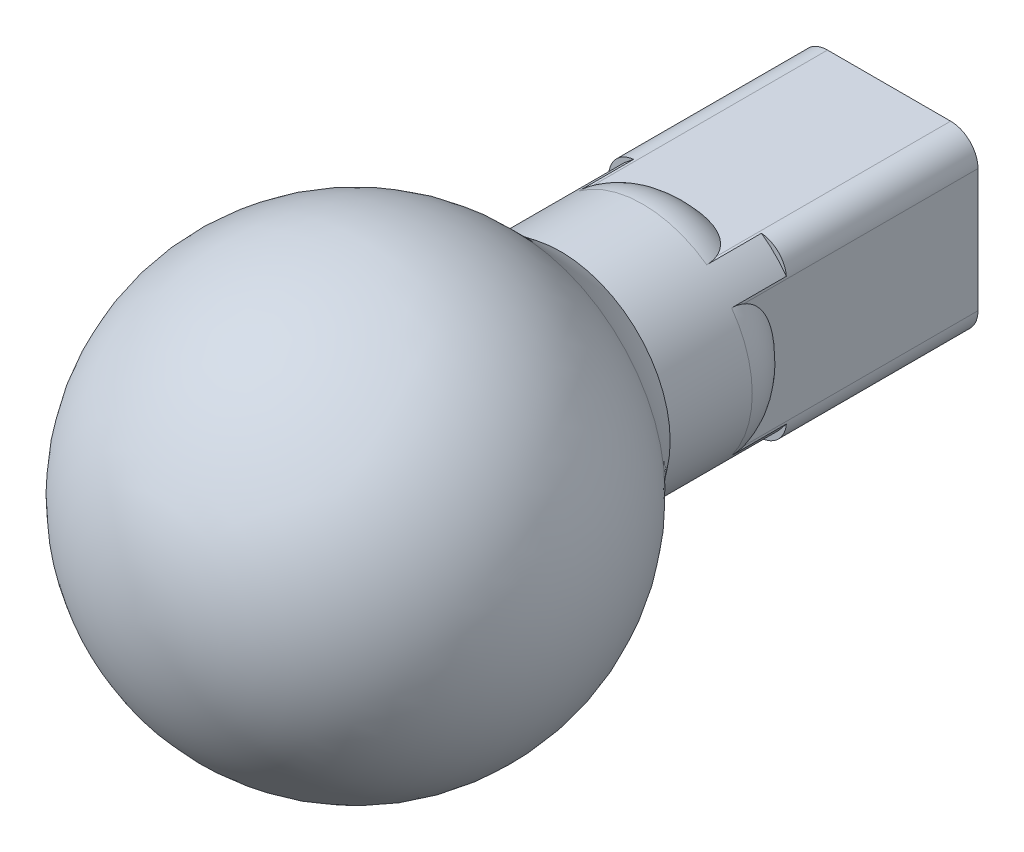
ISO-10303-21;
HEADER;
FILE_DESCRIPTION(('STEP AP214'),'2;1');
FILE_NAME('part.step','',(''),(''),'','','');
FILE_SCHEMA(('AUTOMOTIVE_DESIGN { 1 0 10303 214 1 1 1 1 }'));
ENDSEC;
DATA;
#1=APPLICATION_CONTEXT('core data for automotive mechanical design processes');
#2=APPLICATION_PROTOCOL_DEFINITION('international standard','automotive_design',2000,#1);
#3=PRODUCT_CONTEXT('',#1,'mechanical');
#4=PRODUCT('Part','Part','',(#3));
#5=PRODUCT_RELATED_PRODUCT_CATEGORY('part','',(#4));
#6=PRODUCT_DEFINITION_FORMATION('','',#4);
#7=PRODUCT_DEFINITION_CONTEXT('part definition',#1,'design');
#8=PRODUCT_DEFINITION('design','',#6,#7);
#9=PRODUCT_DEFINITION_SHAPE('','',#8);
#10=(LENGTH_UNIT() NAMED_UNIT(*) SI_UNIT(.MILLI.,.METRE.));
#11=(NAMED_UNIT(*) PLANE_ANGLE_UNIT() SI_UNIT($,.RADIAN.));
#12=(NAMED_UNIT(*) SI_UNIT($,.STERADIAN.) SOLID_ANGLE_UNIT());
#13=UNCERTAINTY_MEASURE_WITH_UNIT(LENGTH_MEASURE(1.E-05),#10,'distance_accuracy_value','');
#14=(GEOMETRIC_REPRESENTATION_CONTEXT(3) GLOBAL_UNCERTAINTY_ASSIGNED_CONTEXT((#13)) GLOBAL_UNIT_ASSIGNED_CONTEXT((#10,
#11,#12)) REPRESENTATION_CONTEXT('',''));
#15=CARTESIAN_POINT('',(0.,0.,0.));
#16=DIRECTION('',(0.,0.,1.));
#17=DIRECTION('',(1.,0.,0.));
#18=AXIS2_PLACEMENT_3D('',#15,#16,#17);
#19=CARTESIAN_POINT('',(0.,0.,7.));
#20=DIRECTION('',(0.,0.,1.));
#21=DIRECTION('',(1.,0.,0.));
#22=AXIS2_PLACEMENT_3D('',#19,#20,#21);
#23=PLANE('',#22);
#24=CARTESIAN_POINT('',(0.,0.,7.));
#25=DIRECTION('',(0.,0.,1.));
#26=DIRECTION('',(1.,0.,0.));
#27=AXIS2_PLACEMENT_3D('',#24,#25,#26);
#28=CIRCLE('',#27,4.);
#29=CARTESIAN_POINT('',(3.24619633810982,2.33713699522351,7.));
#30=VERTEX_POINT('',#29);
#31=CARTESIAN_POINT('',(2.33713699522351,3.24619633810982,7.));
#32=VERTEX_POINT('',#31);
#33=EDGE_CURVE('E348',#30,#32,#28,.T.);
#34=ORIENTED_EDGE('',*,*,#33,.F.);
#35=CARTESIAN_POINT('',(2.25,2.25,7.));
#36=DIRECTION('',(0.,0.,1.));
#37=DIRECTION('',(1.,0.,0.));
#38=AXIS2_PLACEMENT_3D('',#35,#36,#37);
#39=CIRCLE('',#38,1.);
#40=EDGE_CURVE('E303',#30,#32,#39,.T.);
#41=ORIENTED_EDGE('',*,*,#40,.T.);
#42=EDGE_LOOP('',(#34,#41));
#43=FACE_BOUND('',#42,.T.);
#44=ADVANCED_FACE('F35',(#43),#23,.T.);
#45=CARTESIAN_POINT('',(-2.33713699522352,3.24619633810982,7.));
#46=VERTEX_POINT('',#45);
#47=CARTESIAN_POINT('',(-3.24619633810982,2.33713699522351,7.));
#48=VERTEX_POINT('',#47);
#49=EDGE_CURVE('E193',#46,#48,#28,.T.);
#50=ORIENTED_EDGE('',*,*,#49,.F.);
#51=CARTESIAN_POINT('',(-2.25,2.25,7.));
#52=DIRECTION('',(0.,0.,1.));
#53=DIRECTION('',(1.,0.,0.));
#54=AXIS2_PLACEMENT_3D('',#51,#52,#53);
#55=CIRCLE('',#54,1.);
#56=EDGE_CURVE('E290',#46,#48,#55,.T.);
#57=ORIENTED_EDGE('',*,*,#56,.T.);
#58=EDGE_LOOP('',(#50,#57));
#59=FACE_BOUND('',#58,.T.);
#60=ADVANCED_FACE('F338',(#59),#23,.T.);
#61=CARTESIAN_POINT('',(-3.24619633810982,-2.33713699522351,7.));
#62=VERTEX_POINT('',#61);
#63=CARTESIAN_POINT('',(-2.33713699522351,-3.24619633810982,7.));
#64=VERTEX_POINT('',#63);
#65=EDGE_CURVE('E346',#62,#64,#28,.T.);
#66=ORIENTED_EDGE('',*,*,#65,.F.);
#67=CARTESIAN_POINT('',(-2.25,-2.25,7.));
#68=DIRECTION('',(0.,0.,1.));
#69=DIRECTION('',(1.,0.,0.));
#70=AXIS2_PLACEMENT_3D('',#67,#68,#69);
#71=CIRCLE('',#70,1.);
#72=EDGE_CURVE('E329',#62,#64,#71,.T.);
#73=ORIENTED_EDGE('',*,*,#72,.T.);
#74=EDGE_LOOP('',(#66,#73));
#75=FACE_BOUND('',#74,.T.);
#76=ADVANCED_FACE('F362',(#75),#23,.T.);
#77=CARTESIAN_POINT('',(-3.25,-3.25,7.));
#78=DIRECTION('',(1.,0.,0.));
#79=DIRECTION('',(0.,0.,-1.));
#80=AXIS2_PLACEMENT_3D('',#77,#78,#79);
#81=PLANE('',#80);
#82=DIRECTION('',(0.,-1.,0.));
#83=VECTOR('',#82,1.);
#84=CARTESIAN_POINT('',(-3.25,-3.25,0.));
#85=LINE('',#84,#83);
#86=CARTESIAN_POINT('',(-3.25,2.25,0.));
#87=VERTEX_POINT('',#86);
#88=CARTESIAN_POINT('',(-3.25,-2.25,0.));
#89=VERTEX_POINT('',#88);
#90=EDGE_CURVE('E185',#87,#89,#85,.T.);
#91=ORIENTED_EDGE('',*,*,#90,.T.);
#92=DIRECTION('',(0.,0.,-1.));
#93=VECTOR('',#92,1.);
#94=CARTESIAN_POINT('',(-3.25,-2.25,7.));
#95=LINE('',#94,#93);
#96=CARTESIAN_POINT('',(-3.25,-2.25000000000515,8.56827288615324));
#97=VERTEX_POINT('',#96);
#98=EDGE_CURVE('E60',#89,#97,#95,.F.);
#99=ORIENTED_EDGE('',*,*,#98,.T.);
#100=CARTESIAN_POINT('',(-3.25,-2.33184476327221,9.));
#101=CARTESIAN_POINT('',(-3.25,-2.33184943666887,8.9627345235144));
#102=CARTESIAN_POINT('',(-3.25,-2.33005654293997,8.92549207089758));
#103=CARTESIAN_POINT('',(-3.25,-2.32294012074108,8.85136754110742));
#104=CARTESIAN_POINT('',(-3.25,-2.31761866411863,8.8144852653386));
#105=CARTESIAN_POINT('',(-3.25,-2.2965721673292,8.70539184069068));
#106=CARTESIAN_POINT('',(-3.25,-2.27576249212747,8.63410526115651));
#107=CARTESIAN_POINT('',(-3.25,-2.22194304882949,8.49655498720431));
#108=CARTESIAN_POINT('',(-3.25,-2.18895561857896,8.43028236214355));
#109=CARTESIAN_POINT('',(-3.25,-2.11259462038811,8.3039349302347));
#110=CARTESIAN_POINT('',(-3.25,-2.06920300360105,8.24387115633339));
#111=CARTESIAN_POINT('',(-3.25,-1.96079862965051,8.11511609958181));
#112=CARTESIAN_POINT('',(-3.25,-1.89312868129662,8.04866841826497));
#113=CARTESIAN_POINT('',(-3.25,-1.74794933102802,7.92766951826205));
#114=CARTESIAN_POINT('',(-3.25,-1.67042718705922,7.8731339586207));
#115=CARTESIAN_POINT('',(-3.25,-1.47416014392506,7.75447952283787));
#116=CARTESIAN_POINT('',(-3.25,-1.35192308571132,7.69617553347358));
#117=CARTESIAN_POINT('',(-3.25,-1.09986910151451,7.59920076434416));
#118=CARTESIAN_POINT('',(-3.25,-0.970033129763013,7.56058189736874));
#119=CARTESIAN_POINT('',(-3.25,-0.739527579081246,7.50745720253537));
#120=CARTESIAN_POINT('',(-3.25,-0.639651514317396,7.48934081473367));
#121=CARTESIAN_POINT('',(-3.25,-0.43869568438947,7.46141344972969));
#122=CARTESIAN_POINT('',(-3.25,-0.337615244540992,7.45160737341321));
#123=CARTESIAN_POINT('',(-3.25,-0.134906592736089,7.43970428156127));
#124=CARTESIAN_POINT('',(-3.25,-0.0332779058929494,7.43761563127573));
#125=CARTESIAN_POINT('',(-3.25,0.169817750881897,7.44103397040527));
#126=CARTESIAN_POINT('',(-3.25,0.27128476942841,7.44653790403193));
#127=CARTESIAN_POINT('',(-3.25,0.450079688473598,7.46329966326444));
#128=CARTESIAN_POINT('',(-3.25,0.527558925971241,7.47293084987838));
#129=CARTESIAN_POINT('',(-3.25,0.681720288140023,7.49723412381278));
#130=CARTESIAN_POINT('',(-3.25,0.758402202214013,7.51190750974934));
#131=CARTESIAN_POINT('',(-3.25,0.986168202620937,7.56410772192339));
#132=CARTESIAN_POINT('',(-3.25,1.13559292047573,7.60986509376066));
#133=CARTESIAN_POINT('',(-3.25,1.37333713873282,7.70755954256049));
#134=CARTESIAN_POINT('',(-3.25,1.46482245815193,7.7518021413259));
#135=CARTESIAN_POINT('',(-3.25,1.64051732173335,7.8531244069064));
#136=CARTESIAN_POINT('',(-3.25,1.7247318180032,7.91019523949614));
#137=CARTESIAN_POINT('',(-3.25,1.86871334549109,8.02710446876049));
#138=CARTESIAN_POINT('',(-3.25,1.93020026257033,8.08481052579856));
#139=CARTESIAN_POINT('',(-3.25,2.04292259269611,8.20954294523711));
#140=CARTESIAN_POINT('',(-3.25,2.09416881017991,8.27655935681019));
#141=CARTESIAN_POINT('',(-3.25,2.1762895479135,8.4073998726286));
#142=CARTESIAN_POINT('',(-3.25,2.20911640083211,8.46999678817009));
#143=CARTESIAN_POINT('',(-3.25,2.26383795686628,8.59977418369854));
#144=CARTESIAN_POINT('',(-3.25,2.28574935845812,8.66694748263778));
#145=CARTESIAN_POINT('',(-3.25,2.31158130079782,8.7788087049859));
#146=CARTESIAN_POINT('',(-3.25,2.31915476333687,8.82267992553142));
#147=CARTESIAN_POINT('',(-3.25,2.32929595640613,8.91102401773843));
#148=CARTESIAN_POINT('',(-3.25,2.33186047960745,8.95549725654769));
#149=CARTESIAN_POINT('',(-3.25,2.33184476327221,9.));
#150=B_SPLINE_CURVE_WITH_KNOTS('',3,(#100,#101,#102,#103,#104,#105,#106,#107,#108,#109,#110,
#111,#112,#113,#114,#115,#116,#117,#118,#119,#120,#121,#122,#123,#124,#125,#126,#127,#128,#129,
#130,#131,#132,#133,#134,#135,#136,#137,#138,#139,#140,#141,#142,#143,#144,#145,#146,#147,#148,
#149),.UNSPECIFIED.,.F.,.F.,(4,2,2,2,2,2,2,2,2,2,2,2,2,2,2,2,2,2,2,2,2,2,2,2,4),(0.,
0.111709132646851,0.223352731648305,0.444783752578445,0.665810601163508,0.887223690006718,
1.17019033555473,1.45352674486951,1.85756818574354,2.26266970578095,2.5668326669832,
2.87117487930747,3.17584688462728,3.48039630432767,3.7144555630763,3.94857514891577,
4.41496067464628,4.71901288706647,5.02285635049589,5.2748752799244,5.52662689673608,
5.73779153617891,5.94863213588952,6.08192687558443,6.21530693875096),.UNSPECIFIED.);
#151=CARTESIAN_POINT('',(-3.25,2.24999999999993,8.56827288613981));
#152=VERTEX_POINT('',#151);
#153=EDGE_CURVE('E209',#97,#152,#150,.T.);
#154=ORIENTED_EDGE('',*,*,#153,.T.);
#155=DIRECTION('',(0.,0.,-1.));
#156=VECTOR('',#155,1.);
#157=CARTESIAN_POINT('',(-3.25,2.25,7.));
#158=LINE('',#157,#156);
#159=EDGE_CURVE('E326',#152,#87,#158,.T.);
#160=ORIENTED_EDGE('',*,*,#159,.T.);
#161=EDGE_LOOP('',(#91,#99,#154,#160));
#162=FACE_BOUND('',#161,.T.);
#163=ADVANCED_FACE('F380',(#162),#81,.F.);
#164=CARTESIAN_POINT('',(3.25,-3.25,7.));
#165=DIRECTION('',(0.,1.,0.));
#166=DIRECTION('',(-1.,0.,0.));
#167=AXIS2_PLACEMENT_3D('',#164,#165,#166);
#168=PLANE('',#167);
#169=DIRECTION('',(1.,0.,0.));
#170=VECTOR('',#169,1.);
#171=CARTESIAN_POINT('',(3.25,-3.25,0.));
#172=LINE('',#171,#170);
#173=CARTESIAN_POINT('',(-2.25,-3.25,0.));
#174=VERTEX_POINT('',#173);
#175=CARTESIAN_POINT('',(2.25,-3.25,0.));
#176=VERTEX_POINT('',#175);
#177=EDGE_CURVE('E180',#174,#176,#172,.T.);
#178=ORIENTED_EDGE('',*,*,#177,.T.);
#179=DIRECTION('',(0.,0.,-1.));
#180=VECTOR('',#179,1.);
#181=CARTESIAN_POINT('',(2.25,-3.25,7.));
#182=LINE('',#181,#180);
#183=CARTESIAN_POINT('',(2.24999999999486,-3.25,8.56827288612674));
#184=VERTEX_POINT('',#183);
#185=EDGE_CURVE('E158',#176,#184,#182,.F.);
#186=ORIENTED_EDGE('',*,*,#185,.T.);
#187=CARTESIAN_POINT('',(2.3318447632722,-3.25,9.));
#188=CARTESIAN_POINT('',(2.33184943666887,-3.25,8.9627345235144));
#189=CARTESIAN_POINT('',(2.33005654293997,-3.25,8.92549207089758));
#190=CARTESIAN_POINT('',(2.32294012074108,-3.25,8.85136754110742));
#191=CARTESIAN_POINT('',(2.31761866411863,-3.25,8.8144852653386));
#192=CARTESIAN_POINT('',(2.2965721673292,-3.25,8.70539184069068));
#193=CARTESIAN_POINT('',(2.27576249212746,-3.25,8.63410526115651));
#194=CARTESIAN_POINT('',(2.22194304882949,-3.25,8.49655498720431));
#195=CARTESIAN_POINT('',(2.18895561857896,-3.25,8.43028236214355));
#196=CARTESIAN_POINT('',(2.11259462038811,-3.25,8.3039349302347));
#197=CARTESIAN_POINT('',(2.06920300360105,-3.25,8.24387115633339));
#198=CARTESIAN_POINT('',(1.96079862965051,-3.25,8.11511609958182));
#199=CARTESIAN_POINT('',(1.89312868129662,-3.25,8.04866841826497));
#200=CARTESIAN_POINT('',(1.74794933102802,-3.25,7.92766951826205));
#201=CARTESIAN_POINT('',(1.67042718705921,-3.25,7.8731339586207));
#202=CARTESIAN_POINT('',(1.47416014392506,-3.25,7.75447952283787));
#203=CARTESIAN_POINT('',(1.35192308571132,-3.25,7.69617553347358));
#204=CARTESIAN_POINT('',(1.09986910151451,-3.25,7.59920076434416));
#205=CARTESIAN_POINT('',(0.970033129763011,-3.25,7.56058189736874));
#206=CARTESIAN_POINT('',(0.739527579081245,-3.25,7.50745720253537));
#207=CARTESIAN_POINT('',(0.639651514317395,-3.25,7.48934081473367));
#208=CARTESIAN_POINT('',(0.43869568438947,-3.25,7.46141344972969));
#209=CARTESIAN_POINT('',(0.337615244540992,-3.25,7.45160737341321));
#210=CARTESIAN_POINT('',(0.13490659273609,-3.25,7.43970428156127));
#211=CARTESIAN_POINT('',(0.0332779058929506,-3.25,7.43761563127573));
#212=CARTESIAN_POINT('',(-0.169817750881895,-3.25,7.44103397040527));
#213=CARTESIAN_POINT('',(-0.271284769428407,-3.25,7.44653790403193));
#214=CARTESIAN_POINT('',(-0.450079688473596,-3.25,7.46329966326445));
#215=CARTESIAN_POINT('',(-0.527558925971239,-3.25,7.47293084987838));
#216=CARTESIAN_POINT('',(-0.681720288140021,-3.25,7.49723412381278));
#217=CARTESIAN_POINT('',(-0.758402202214011,-3.25,7.51190750974934));
#218=CARTESIAN_POINT('',(-0.986168202620935,-3.25,7.56410772192339));
#219=CARTESIAN_POINT('',(-1.13559292047572,-3.25,7.60986509376066));
#220=CARTESIAN_POINT('',(-1.37333713873282,-3.25,7.70755954256049));
#221=CARTESIAN_POINT('',(-1.46482245815193,-3.25,7.7518021413259));
#222=CARTESIAN_POINT('',(-1.64051732173334,-3.25,7.8531244069064));
#223=CARTESIAN_POINT('',(-1.72473181800319,-3.25,7.91019523949614));
#224=CARTESIAN_POINT('',(-1.86871334549109,-3.25,8.02710446876049));
#225=CARTESIAN_POINT('',(-1.93020026257033,-3.25,8.08481052579856));
#226=CARTESIAN_POINT('',(-2.04292259269611,-3.25,8.20954294523711));
#227=CARTESIAN_POINT('',(-2.09416881017991,-3.25,8.27655935681019));
#228=CARTESIAN_POINT('',(-2.1762895479135,-3.25,8.4073998726286));
#229=CARTESIAN_POINT('',(-2.2091164008321,-3.25,8.46999678817009));
#230=CARTESIAN_POINT('',(-2.26383795686627,-3.25,8.59977418369854));
#231=CARTESIAN_POINT('',(-2.28574935845812,-3.25,8.66694748263778));
#232=CARTESIAN_POINT('',(-2.31158130079781,-3.25,8.7788087049859));
#233=CARTESIAN_POINT('',(-2.31915476333687,-3.25,8.82267992553142));
#234=CARTESIAN_POINT('',(-2.32929595640612,-3.25,8.91102401773843));
#235=CARTESIAN_POINT('',(-2.33186047960744,-3.25,8.95549725654769));
#236=CARTESIAN_POINT('',(-2.3318447632722,-3.25,9.));
#237=B_SPLINE_CURVE_WITH_KNOTS('',3,(#187,#188,#189,#190,#191,#192,#193,#194,#195,#196,#197,
#198,#199,#200,#201,#202,#203,#204,#205,#206,#207,#208,#209,#210,#211,#212,#213,#214,#215,#216,
#217,#218,#219,#220,#221,#222,#223,#224,#225,#226,#227,#228,#229,#230,#231,#232,#233,#234,#235,
#236),.UNSPECIFIED.,.F.,.F.,(4,2,2,2,2,2,2,2,2,2,2,2,2,2,2,2,2,2,2,2,2,2,2,2,4),(0.,
0.111709132646851,0.223352731648305,0.444783752578445,0.665810601163508,0.887223690006717,
1.17019033555473,1.45352674486951,1.85756818574354,2.26266970578095,2.5668326669832,
2.87117487930747,3.17584688462728,3.48039630432766,3.71445556307629,3.94857514891576,
4.41496067464627,4.71901288706647,5.02285635049588,5.27487527992439,5.52662689673607,
5.7377915361789,5.94863213588952,6.08192687558442,6.21530693875095),.UNSPECIFIED.);
#238=CARTESIAN_POINT('',(-2.24999999999993,-3.25,8.56827288613981));
#239=VERTEX_POINT('',#238);
#240=EDGE_CURVE('E276',#184,#239,#237,.T.);
#241=ORIENTED_EDGE('',*,*,#240,.T.);
#242=DIRECTION('',(0.,0.,-1.));
#243=VECTOR('',#242,1.);
#244=CARTESIAN_POINT('',(-2.25,-3.25,7.));
#245=LINE('',#244,#243);
#246=EDGE_CURVE('E163',#239,#174,#245,.T.);
#247=ORIENTED_EDGE('',*,*,#246,.T.);
#248=EDGE_LOOP('',(#178,#186,#241,#247));
#249=FACE_BOUND('',#248,.T.);
#250=ADVANCED_FACE('F390',(#249),#168,.F.);
#251=CARTESIAN_POINT('',(3.25,-3.25,7.));
#252=DIRECTION('',(-1.,0.,0.));
#253=DIRECTION('',(0.,0.,1.));
#254=AXIS2_PLACEMENT_3D('',#251,#252,#253);
#255=PLANE('',#254);
#256=CARTESIAN_POINT('',(3.25,2.3318447632722,9.));
#257=CARTESIAN_POINT('',(3.25,2.33184943666886,8.9627345235144));
#258=CARTESIAN_POINT('',(3.25,2.33005654293997,8.92549207089758));
#259=CARTESIAN_POINT('',(3.25,2.32294012074107,8.85136754110742));
#260=CARTESIAN_POINT('',(3.25,2.31761866411862,8.8144852653386));
#261=CARTESIAN_POINT('',(3.25,2.2965721673292,8.70539184069068));
#262=CARTESIAN_POINT('',(3.25,2.27576249212746,8.63410526115651));
#263=CARTESIAN_POINT('',(3.25,2.22194304882948,8.49655498720431));
#264=CARTESIAN_POINT('',(3.25,2.18895561857895,8.43028236214355));
#265=CARTESIAN_POINT('',(3.25,2.11259462038811,8.3039349302347));
#266=CARTESIAN_POINT('',(3.25,2.06920300360104,8.24387115633339));
#267=CARTESIAN_POINT('',(3.25,1.9607986296505,8.11511609958181));
#268=CARTESIAN_POINT('',(3.25,1.89312868129661,8.04866841826497));
#269=CARTESIAN_POINT('',(3.25,1.74794933102802,7.92766951826205));
#270=CARTESIAN_POINT('',(3.25,1.67042718705921,7.8731339586207));
#271=CARTESIAN_POINT('',(3.25,1.47416014392506,7.75447952283787));
#272=CARTESIAN_POINT('',(3.25,1.35192308571131,7.69617553347358));
#273=CARTESIAN_POINT('',(3.25,1.0998691015145,7.59920076434416));
#274=CARTESIAN_POINT('',(3.25,0.970033129763006,7.56058189736874));
#275=CARTESIAN_POINT('',(3.25,0.73952757908124,7.50745720253537));
#276=CARTESIAN_POINT('',(3.25,0.63965151431739,7.48934081473368));
#277=CARTESIAN_POINT('',(3.25,0.438695684389466,7.4614134497297));
#278=CARTESIAN_POINT('',(3.25,0.337615244540988,7.45160737341321));
#279=CARTESIAN_POINT('',(3.25,0.134906592736088,7.43970428156127));
#280=CARTESIAN_POINT('',(3.25,0.0332779058929487,7.43761563127574));
#281=CARTESIAN_POINT('',(3.25,-0.169817750881896,7.44103397040527));
#282=CARTESIAN_POINT('',(3.25,-0.271284769428408,7.44653790403193));
#283=CARTESIAN_POINT('',(3.25,-0.450079688473596,7.46329966326445));
#284=CARTESIAN_POINT('',(3.25,-0.527558925971238,7.47293084987839));
#285=CARTESIAN_POINT('',(3.25,-0.681720288140021,7.49723412381279));
#286=CARTESIAN_POINT('',(3.25,-0.758402202214011,7.51190750974934));
#287=CARTESIAN_POINT('',(3.25,-0.986168202620935,7.56410772192339));
#288=CARTESIAN_POINT('',(3.25,-1.13559292047573,7.60986509376066));
#289=CARTESIAN_POINT('',(3.25,-1.37333713873282,7.70755954256049));
#290=CARTESIAN_POINT('',(3.25,-1.46482245815193,7.7518021413259));
#291=CARTESIAN_POINT('',(3.25,-1.64051732173334,7.8531244069064));
#292=CARTESIAN_POINT('',(3.25,-1.72473181800319,7.91019523949615));
#293=CARTESIAN_POINT('',(3.25,-1.86871334549109,8.02710446876049));
#294=CARTESIAN_POINT('',(3.25,-1.93020026257033,8.08481052579856));
#295=CARTESIAN_POINT('',(3.25,-2.04292259269611,8.20954294523711));
#296=CARTESIAN_POINT('',(3.25,-2.0941688101799,8.2765593568102));
#297=CARTESIAN_POINT('',(3.25,-2.1762895479135,8.4073998726286));
#298=CARTESIAN_POINT('',(3.25,-2.2091164008321,8.4699967881701));
#299=CARTESIAN_POINT('',(3.25,-2.26383795686627,8.59977418369854));
#300=CARTESIAN_POINT('',(3.25,-2.28574935845812,8.66694748263778));
#301=CARTESIAN_POINT('',(3.25,-2.31158130079781,8.7788087049859));
#302=CARTESIAN_POINT('',(3.25,-2.31915476333686,8.82267992553143));
#303=CARTESIAN_POINT('',(3.25,-2.32929595640612,8.91102401773843));
#304=CARTESIAN_POINT('',(3.25,-2.33186047960744,8.9554972565477));
#305=CARTESIAN_POINT('',(3.25,-2.3318447632722,9.));
#306=B_SPLINE_CURVE_WITH_KNOTS('',3,(#256,#257,#258,#259,#260,#261,#262,#263,#264,#265,#266,
#267,#268,#269,#270,#271,#272,#273,#274,#275,#276,#277,#278,#279,#280,#281,#282,#283,#284,#285,
#286,#287,#288,#289,#290,#291,#292,#293,#294,#295,#296,#297,#298,#299,#300,#301,#302,#303,#304,
#305),.UNSPECIFIED.,.F.,.F.,(4,2,2,2,2,2,2,2,2,2,2,2,2,2,2,2,2,2,2,2,2,2,2,2,4),(0.,
0.111709132646849,0.223352731648305,0.444783752578445,0.665810601163508,0.887223690006718,
1.17019033555473,1.45352674486951,1.85756818574355,2.26266970578095,2.5668326669832,
2.87117487930747,3.17584688462727,3.48039630432766,3.71445556307629,3.94857514891576,
4.41496067464627,4.71901288706647,5.02285635049588,5.27487527992439,5.52662689673607,
5.7377915361789,5.94863213588951,6.08192687558442,6.21530693875095),.UNSPECIFIED.);
#307=CARTESIAN_POINT('',(3.25,2.25000000000515,8.56827288615325));
#308=VERTEX_POINT('',#307);
#309=CARTESIAN_POINT('',(3.25,-2.24999999999993,8.56827288613982));
#310=VERTEX_POINT('',#309);
#311=EDGE_CURVE('E173',#308,#310,#306,.T.);
#312=ORIENTED_EDGE('',*,*,#311,.T.);
#313=DIRECTION('',(0.,0.,-1.));
#314=VECTOR('',#313,1.);
#315=CARTESIAN_POINT('',(3.25,-2.25,7.));
#316=LINE('',#315,#314);
#317=CARTESIAN_POINT('',(3.25,-2.25,0.));
#318=VERTEX_POINT('',#317);
#319=EDGE_CURVE('E157',#310,#318,#316,.T.);
#320=ORIENTED_EDGE('',*,*,#319,.T.);
#321=DIRECTION('',(0.,1.,0.));
#322=VECTOR('',#321,1.);
#323=CARTESIAN_POINT('',(3.25,-3.25,0.));
#324=LINE('',#323,#322);
#325=CARTESIAN_POINT('',(3.25,2.25,0.));
#326=VERTEX_POINT('',#325);
#327=EDGE_CURVE('E170',#318,#326,#324,.T.);
#328=ORIENTED_EDGE('',*,*,#327,.T.);
#329=DIRECTION('',(0.,0.,-1.));
#330=VECTOR('',#329,1.);
#331=CARTESIAN_POINT('',(3.25,2.25,7.));
#332=LINE('',#331,#330);
#333=EDGE_CURVE('E175',#326,#308,#332,.F.);
#334=ORIENTED_EDGE('',*,*,#333,.T.);
#335=EDGE_LOOP('',(#312,#320,#328,#334));
#336=FACE_BOUND('',#335,.T.);
#337=ADVANCED_FACE('F169',(#336),#255,.F.);
#338=CARTESIAN_POINT('',(3.25,3.25,7.));
#339=DIRECTION('',(0.,-1.,0.));
#340=DIRECTION('',(1.,0.,0.));
#341=AXIS2_PLACEMENT_3D('',#338,#339,#340);
#342=PLANE('',#341);
#343=CARTESIAN_POINT('',(-2.3318447632722,3.25,9.));
#344=CARTESIAN_POINT('',(-2.33184943666887,3.25,8.9627345235144));
#345=CARTESIAN_POINT('',(-2.33005654293997,3.25,8.92549207089758));
#346=CARTESIAN_POINT('',(-2.32294012074108,3.25,8.85136754110742));
#347=CARTESIAN_POINT('',(-2.31761866411863,3.25,8.8144852653386));
#348=CARTESIAN_POINT('',(-2.2965721673292,3.25,8.70539184069068));
#349=CARTESIAN_POINT('',(-2.27576249212746,3.25,8.63410526115651));
#350=CARTESIAN_POINT('',(-2.22194304882949,3.25,8.49655498720431));
#351=CARTESIAN_POINT('',(-2.18895561857896,3.25,8.43028236214355));
#352=CARTESIAN_POINT('',(-2.11259462038811,3.25,8.3039349302347));
#353=CARTESIAN_POINT('',(-2.06920300360105,3.25,8.24387115633339));
#354=CARTESIAN_POINT('',(-1.96079862965051,3.25,8.11511609958182));
#355=CARTESIAN_POINT('',(-1.89312868129662,3.25,8.04866841826497));
#356=CARTESIAN_POINT('',(-1.74794933102802,3.25,7.92766951826205));
#357=CARTESIAN_POINT('',(-1.67042718705921,3.25,7.8731339586207));
#358=CARTESIAN_POINT('',(-1.47416014392506,3.25,7.75447952283787));
#359=CARTESIAN_POINT('',(-1.35192308571132,3.25,7.69617553347358));
#360=CARTESIAN_POINT('',(-1.09986910151451,3.25,7.59920076434416));
#361=CARTESIAN_POINT('',(-0.970033129763011,3.25,7.56058189736874));
#362=CARTESIAN_POINT('',(-0.739527579081245,3.25,7.50745720253537));
#363=CARTESIAN_POINT('',(-0.639651514317394,3.25,7.48934081473367));
#364=CARTESIAN_POINT('',(-0.438695684389469,3.25,7.46141344972969));
#365=CARTESIAN_POINT('',(-0.337615244540992,3.25,7.45160737341321));
#366=CARTESIAN_POINT('',(-0.13490659273609,3.25,7.43970428156127));
#367=CARTESIAN_POINT('',(-0.0332779058929508,3.25,7.43761563127573));
#368=CARTESIAN_POINT('',(0.169817750881895,3.25,7.44103397040527));
#369=CARTESIAN_POINT('',(0.271284769428407,3.25,7.44653790403193));
#370=CARTESIAN_POINT('',(0.450079688473595,3.25,7.46329966326445));
#371=CARTESIAN_POINT('',(0.527558925971237,3.25,7.47293084987838));
#372=CARTESIAN_POINT('',(0.68172028814002,3.25,7.49723412381278));
#373=CARTESIAN_POINT('',(0.75840220221401,3.25,7.51190750974934));
#374=CARTESIAN_POINT('',(0.986168202620934,3.25,7.56410772192339));
#375=CARTESIAN_POINT('',(1.13559292047572,3.25,7.60986509376066));
#376=CARTESIAN_POINT('',(1.37333713873282,3.25,7.70755954256049));
#377=CARTESIAN_POINT('',(1.46482245815193,3.25,7.7518021413259));
#378=CARTESIAN_POINT('',(1.64051732173334,3.25,7.8531244069064));
#379=CARTESIAN_POINT('',(1.72473181800319,3.25,7.91019523949614));
#380=CARTESIAN_POINT('',(1.86871334549109,3.25,8.02710446876049));
#381=CARTESIAN_POINT('',(1.93020026257033,3.25,8.08481052579856));
#382=CARTESIAN_POINT('',(2.04292259269611,3.25,8.20954294523711));
#383=CARTESIAN_POINT('',(2.09416881017991,3.25,8.27655935681019));
#384=CARTESIAN_POINT('',(2.1762895479135,3.25,8.4073998726286));
#385=CARTESIAN_POINT('',(2.2091164008321,3.25,8.46999678817009));
#386=CARTESIAN_POINT('',(2.26383795686627,3.25,8.59977418369854));
#387=CARTESIAN_POINT('',(2.28574935845812,3.25,8.66694748263778));
#388=CARTESIAN_POINT('',(2.31158130079781,3.25,8.7788087049859));
#389=CARTESIAN_POINT('',(2.31915476333687,3.25,8.82267992553142));
#390=CARTESIAN_POINT('',(2.32929595640612,3.25,8.91102401773843));
#391=CARTESIAN_POINT('',(2.33186047960744,3.25,8.95549725654769));
#392=CARTESIAN_POINT('',(2.3318447632722,3.25,9.));
#393=B_SPLINE_CURVE_WITH_KNOTS('',3,(#343,#344,#345,#346,#347,#348,#349,#350,#351,#352,#353,
#354,#355,#356,#357,#358,#359,#360,#361,#362,#363,#364,#365,#366,#367,#368,#369,#370,#371,#372,
#373,#374,#375,#376,#377,#378,#379,#380,#381,#382,#383,#384,#385,#386,#387,#388,#389,#390,#391,
#392),.UNSPECIFIED.,.F.,.F.,(4,2,2,2,2,2,2,2,2,2,2,2,2,2,2,2,2,2,2,2,2,2,2,2,4),(0.,
0.111709132646851,0.223352731648305,0.444783752578445,0.665810601163508,0.887223690006717,
1.17019033555473,1.45352674486951,1.85756818574354,2.26266970578095,2.5668326669832,
2.87117487930747,3.17584688462728,3.48039630432766,3.71445556307629,3.94857514891576,
4.41496067464627,4.71901288706647,5.02285635049588,5.2748752799244,5.52662689673607,
5.7377915361789,5.94863213588952,6.08192687558442,6.21530693875095),.UNSPECIFIED.);
#394=CARTESIAN_POINT('',(-2.25000000000515,3.25,8.56827288615324));
#395=VERTEX_POINT('',#394);
#396=CARTESIAN_POINT('',(2.24999999999994,3.25,8.56827288613982));
#397=VERTEX_POINT('',#396);
#398=EDGE_CURVE('E201',#395,#397,#393,.T.);
#399=ORIENTED_EDGE('',*,*,#398,.T.);
#400=DIRECTION('',(0.,0.,-1.));
#401=VECTOR('',#400,1.);
#402=CARTESIAN_POINT('',(2.25,3.25,7.));
#403=LINE('',#402,#401);
#404=CARTESIAN_POINT('',(2.25,3.25,0.));
#405=VERTEX_POINT('',#404);
#406=EDGE_CURVE('E322',#397,#405,#403,.T.);
#407=ORIENTED_EDGE('',*,*,#406,.T.);
#408=DIRECTION('',(-1.,0.,0.));
#409=VECTOR('',#408,1.);
#410=CARTESIAN_POINT('',(3.25,3.25,0.));
#411=LINE('',#410,#409);
#412=CARTESIAN_POINT('',(-2.25,3.25,0.));
#413=VERTEX_POINT('',#412);
#414=EDGE_CURVE('E179',#405,#413,#411,.T.);
#415=ORIENTED_EDGE('',*,*,#414,.T.);
#416=DIRECTION('',(0.,0.,-1.));
#417=VECTOR('',#416,1.);
#418=CARTESIAN_POINT('',(-2.25,3.25,7.));
#419=LINE('',#418,#417);
#420=EDGE_CURVE('E320',#413,#395,#419,.F.);
#421=ORIENTED_EDGE('',*,*,#420,.T.);
#422=EDGE_LOOP('',(#399,#407,#415,#421));
#423=FACE_BOUND('',#422,.T.);
#424=ADVANCED_FACE('F215',(#423),#342,.F.);
#425=CARTESIAN_POINT('',(2.33713699522351,-3.24619633810982,7.));
#426=VERTEX_POINT('',#425);
#427=CARTESIAN_POINT('',(3.24619633810982,-2.33713699522351,7.));
#428=VERTEX_POINT('',#427);
#429=EDGE_CURVE('E183',#426,#428,#28,.T.);
#430=ORIENTED_EDGE('',*,*,#429,.F.);
#431=CARTESIAN_POINT('',(2.25,-2.25,7.));
#432=DIRECTION('',(0.,0.,1.));
#433=DIRECTION('',(1.,0.,0.));
#434=AXIS2_PLACEMENT_3D('',#431,#432,#433);
#435=CIRCLE('',#434,1.);
#436=EDGE_CURVE('E318',#426,#428,#435,.T.);
#437=ORIENTED_EDGE('',*,*,#436,.T.);
#438=EDGE_LOOP('',(#430,#437));
#439=FACE_BOUND('',#438,.T.);
#440=ADVANCED_FACE('F373',(#439),#23,.T.);
#441=CARTESIAN_POINT('',(0.,0.,0.));
#442=DIRECTION('',(0.,0.,1.));
#443=DIRECTION('',(1.,0.,0.));
#444=AXIS2_PLACEMENT_3D('',#441,#442,#443);
#445=PLANE('',#444);
#446=ORIENTED_EDGE('',*,*,#327,.F.);
#447=CARTESIAN_POINT('',(2.25,-2.25,0.));
#448=DIRECTION('',(0.,0.,1.));
#449=DIRECTION('',(1.,0.,0.));
#450=AXIS2_PLACEMENT_3D('',#447,#448,#449);
#451=CIRCLE('',#450,1.);
#452=EDGE_CURVE('E152',#318,#176,#451,.F.);
#453=ORIENTED_EDGE('',*,*,#452,.T.);
#454=ORIENTED_EDGE('',*,*,#177,.F.);
#455=CARTESIAN_POINT('',(-2.25,-2.25,0.));
#456=DIRECTION('',(0.,0.,1.));
#457=DIRECTION('',(1.,0.,0.));
#458=AXIS2_PLACEMENT_3D('',#455,#456,#457);
#459=CIRCLE('',#458,1.);
#460=EDGE_CURVE('E381',#174,#89,#459,.F.);
#461=ORIENTED_EDGE('',*,*,#460,.T.);
#462=ORIENTED_EDGE('',*,*,#90,.F.);
#463=CARTESIAN_POINT('',(-2.25,2.25,0.));
#464=DIRECTION('',(0.,0.,1.));
#465=DIRECTION('',(1.,0.,0.));
#466=AXIS2_PLACEMENT_3D('',#463,#464,#465);
#467=CIRCLE('',#466,1.);
#468=EDGE_CURVE('E174',#87,#413,#467,.F.);
#469=ORIENTED_EDGE('',*,*,#468,.T.);
#470=ORIENTED_EDGE('',*,*,#414,.F.);
#471=CARTESIAN_POINT('',(2.25,2.25,0.));
#472=DIRECTION('',(0.,0.,1.));
#473=DIRECTION('',(1.,0.,0.));
#474=AXIS2_PLACEMENT_3D('',#471,#472,#473);
#475=CIRCLE('',#474,1.);
#476=EDGE_CURVE('E164',#405,#326,#475,.F.);
#477=ORIENTED_EDGE('',*,*,#476,.T.);
#478=EDGE_LOOP('',(#446,#453,#454,#461,#462,#469,#470,#477));
#479=FACE_BOUND('',#478,.T.);
#480=ADVANCED_FACE('F177',(#479),#445,.F.);
#481=CARTESIAN_POINT('',(0.,0.,12.));
#482=DIRECTION('',(0.,0.,-1.));
#483=DIRECTION('',(-1.,0.,0.));
#484=AXIS2_PLACEMENT_3D('',#481,#482,#483);
#485=CYLINDRICAL_SURFACE('',#484,4.);
#486=CARTESIAN_POINT('',(0.,0.,12.));
#487=DIRECTION('',(0.,0.,1.));
#488=DIRECTION('',(1.,0.,0.));
#489=AXIS2_PLACEMENT_3D('',#486,#487,#488);
#490=CIRCLE('',#489,4.);
#491=CARTESIAN_POINT('',(4.,0.,12.));
#492=VERTEX_POINT('',#491);
#493=EDGE_CURVE('E375',#492,#492,#490,.T.);
#494=ORIENTED_EDGE('',*,*,#493,.F.);
#495=EDGE_LOOP('',(#494));
#496=FACE_BOUND('',#495,.T.);
#497=CARTESIAN_POINT('',(0.,0.,9.));
#498=DIRECTION('',(0.,0.,1.));
#499=DIRECTION('',(1.,0.,0.));
#500=AXIS2_PLACEMENT_3D('',#497,#498,#499);
#501=CIRCLE('',#500,4.);
#502=CARTESIAN_POINT('',(-2.33713699522351,-3.24619633810982,9.));
#503=VERTEX_POINT('',#502);
#504=CARTESIAN_POINT('',(2.33713699522351,-3.24619633810982,9.));
#505=VERTEX_POINT('',#504);
#506=EDGE_CURVE('E195',#503,#505,#501,.T.);
#507=ORIENTED_EDGE('',*,*,#506,.T.);
#508=DIRECTION('',(0.,0.,-1.));
#509=VECTOR('',#508,1.);
#510=CARTESIAN_POINT('',(2.33713699522351,-3.24619633810982,9.));
#511=LINE('',#510,#509);
#512=EDGE_CURVE('E310',#505,#426,#511,.T.);
#513=ORIENTED_EDGE('',*,*,#512,.T.);
#514=ORIENTED_EDGE('',*,*,#429,.T.);
#515=DIRECTION('',(0.,0.,-1.));
#516=VECTOR('',#515,1.);
#517=CARTESIAN_POINT('',(3.24619633810982,-2.33713699522351,7.));
#518=LINE('',#517,#516);
#519=CARTESIAN_POINT('',(3.24619633810982,-2.33713699522351,9.));
#520=VERTEX_POINT('',#519);
#521=EDGE_CURVE('E307',#428,#520,#518,.F.);
#522=ORIENTED_EDGE('',*,*,#521,.T.);
#523=CARTESIAN_POINT('',(0.,0.,9.));
#524=DIRECTION('',(0.,0.,1.));
#525=DIRECTION('',(1.,0.,0.));
#526=AXIS2_PLACEMENT_3D('',#523,#524,#525);
#527=CIRCLE('',#526,4.);
#528=CARTESIAN_POINT('',(3.24619633810982,2.33713699522351,9.));
#529=VERTEX_POINT('',#528);
#530=EDGE_CURVE('E192',#520,#529,#527,.T.);
#531=ORIENTED_EDGE('',*,*,#530,.T.);
#532=DIRECTION('',(0.,0.,-1.));
#533=VECTOR('',#532,1.);
#534=CARTESIAN_POINT('',(3.24619633810982,2.33713699522351,9.));
#535=LINE('',#534,#533);
#536=EDGE_CURVE('E301',#529,#30,#535,.T.);
#537=ORIENTED_EDGE('',*,*,#536,.T.);
#538=ORIENTED_EDGE('',*,*,#33,.T.);
#539=DIRECTION('',(0.,0.,-1.));
#540=VECTOR('',#539,1.);
#541=CARTESIAN_POINT('',(2.33713699522351,3.24619633810982,7.));
#542=LINE('',#541,#540);
#543=CARTESIAN_POINT('',(2.33713699522351,3.24619633810982,9.));
#544=VERTEX_POINT('',#543);
#545=EDGE_CURVE('E308',#32,#544,#542,.F.);
#546=ORIENTED_EDGE('',*,*,#545,.T.);
#547=CARTESIAN_POINT('',(0.,0.,9.));
#548=DIRECTION('',(0.,0.,1.));
#549=DIRECTION('',(1.,0.,0.));
#550=AXIS2_PLACEMENT_3D('',#547,#548,#549);
#551=CIRCLE('',#550,4.);
#552=CARTESIAN_POINT('',(-2.33713699522351,3.24619633810982,9.));
#553=VERTEX_POINT('',#552);
#554=EDGE_CURVE('E199',#544,#553,#551,.T.);
#555=ORIENTED_EDGE('',*,*,#554,.T.);
#556=DIRECTION('',(0.,0.,-1.));
#557=VECTOR('',#556,1.);
#558=CARTESIAN_POINT('',(-2.33713699522351,3.24619633810982,9.));
#559=LINE('',#558,#557);
#560=EDGE_CURVE('E345',#553,#46,#559,.T.);
#561=ORIENTED_EDGE('',*,*,#560,.T.);
#562=ORIENTED_EDGE('',*,*,#49,.T.);
#563=DIRECTION('',(0.,0.,-1.));
#564=VECTOR('',#563,1.);
#565=CARTESIAN_POINT('',(-3.24619633810982,2.33713699522351,7.));
#566=LINE('',#565,#564);
#567=CARTESIAN_POINT('',(-3.24619633810982,2.33713699522351,9.));
#568=VERTEX_POINT('',#567);
#569=EDGE_CURVE('E344',#48,#568,#566,.F.);
#570=ORIENTED_EDGE('',*,*,#569,.T.);
#571=CARTESIAN_POINT('',(0.,0.,9.));
#572=DIRECTION('',(0.,0.,1.));
#573=DIRECTION('',(1.,0.,0.));
#574=AXIS2_PLACEMENT_3D('',#571,#572,#573);
#575=CIRCLE('',#574,4.);
#576=CARTESIAN_POINT('',(-3.24619633810982,-2.33713699522352,9.));
#577=VERTEX_POINT('',#576);
#578=EDGE_CURVE('E197',#568,#577,#575,.T.);
#579=ORIENTED_EDGE('',*,*,#578,.T.);
#580=DIRECTION('',(0.,0.,-1.));
#581=VECTOR('',#580,1.);
#582=CARTESIAN_POINT('',(-3.24619633810982,-2.33713699522352,9.));
#583=LINE('',#582,#581);
#584=EDGE_CURVE('E313',#577,#62,#583,.T.);
#585=ORIENTED_EDGE('',*,*,#584,.T.);
#586=ORIENTED_EDGE('',*,*,#65,.T.);
#587=DIRECTION('',(0.,0.,-1.));
#588=VECTOR('',#587,1.);
#589=CARTESIAN_POINT('',(-2.33713699522351,-3.24619633810982,7.));
#590=LINE('',#589,#588);
#591=EDGE_CURVE('E352',#64,#503,#590,.F.);
#592=ORIENTED_EDGE('',*,*,#591,.T.);
#593=EDGE_LOOP('',(#507,#513,#514,#522,#531,#537,#538,#546,#555,#561,#562,#570,#579,#585,#586,#592));
#594=FACE_BOUND('',#593,.T.);
#595=ADVANCED_FACE('F343',(#496,#594),#485,.T.);
#596=CARTESIAN_POINT('',(0.,0.,19.5));
#597=DIRECTION('',(0.,0.,-1.));
#598=DIRECTION('',(1.,0.,0.));
#599=AXIS2_PLACEMENT_3D('',#596,#597,#598);
#600=SPHERICAL_SURFACE('',#599,8.);
#601=CARTESIAN_POINT('',(0.,0.,13.6088482083187));
#602=DIRECTION('',(0.,0.,1.));
#603=DIRECTION('',(1.,0.,0.));
#604=AXIS2_PLACEMENT_3D('',#601,#602,#603);
#605=CIRCLE('',#604,5.41242372393094);
#606=CARTESIAN_POINT('',(5.41242372393094,0.,13.6088482083187));
#607=VERTEX_POINT('',#606);
#608=EDGE_CURVE('E189',#607,#607,#605,.T.);
#609=ORIENTED_EDGE('',*,*,#608,.T.);
#610=EDGE_LOOP('',(#609));
#611=FACE_BOUND('',#610,.T.);
#612=ADVANCED_FACE('F460',(#611),#600,.T.);
#613=CARTESIAN_POINT('',(0.,0.,6.24490846871713));
#614=DIRECTION('',(0.,0.,1.));
#615=DIRECTION('',(1.,0.,0.));
#616=AXIS2_PLACEMENT_3D('',#613,#614,#615);
#617=TOROIDAL_SURFACE('',#616,12.1779533788446,10.);
#618=ORIENTED_EDGE('',*,*,#493,.T.);
#619=EDGE_LOOP('',(#618));
#620=FACE_BOUND('',#619,.T.);
#621=ORIENTED_EDGE('',*,*,#608,.F.);
#622=EDGE_LOOP('',(#621));
#623=FACE_BOUND('',#622,.T.);
#624=ADVANCED_FACE('F224',(#620,#623),#617,.F.);
#625=CARTESIAN_POINT('',(0.,0.,9.));
#626=DIRECTION('',(0.,0.,1.));
#627=DIRECTION('',(1.,0.,0.));
#628=AXIS2_PLACEMENT_3D('',#625,#626,#627);
#629=DEGENERATE_TOROIDAL_SURFACE('',#628,2.,2.,.T.);
#630=ORIENTED_EDGE('',*,*,#554,.F.);
#631=CARTESIAN_POINT('',(2.33713699522351,3.24619633810982,9.));
#632=CARTESIAN_POINT('',(2.33718388598119,3.24617113755484,8.96288559230426));
#633=CARTESIAN_POINT('',(2.33512478486388,3.24637293299793,8.92580566684867));
#634=CARTESIAN_POINT('',(2.32720223406589,3.24702862068228,8.85237725472059));
#635=CARTESIAN_POINT('',(2.3213720317039,3.24748030483131,8.81602521125335));
#636=CARTESIAN_POINT('',(2.30630663557085,3.24844007489318,8.7440771266253));
#637=CARTESIAN_POINT('',(2.29707329233766,3.24894813004823,8.70848068569281));
#638=CARTESIAN_POINT('',(2.27563975387553,3.24972964154793,8.63784077155662));
#639=CARTESIAN_POINT('',(2.26341417142855,3.25000099460462,8.6028049185132));
#640=CARTESIAN_POINT('',(2.24999999999994,3.25,8.56827288613982));
#641=B_SPLINE_CURVE_WITH_KNOTS('',3,(#631,#632,#633,#634,#635,#636,#637,#638,#639,#640),
.UNSPECIFIED.,.F.,.F.,(4,2,2,2,4),(0.,0.111231510425809,0.221495491137459,0.331699601465315,
0.442873270238339),.UNSPECIFIED.);
#642=EDGE_CURVE('E231',#544,#397,#641,.T.);
#643=ORIENTED_EDGE('',*,*,#642,.T.);
#644=ORIENTED_EDGE('',*,*,#398,.F.);
#645=CARTESIAN_POINT('',(-2.25,3.25,8.56827288615324));
#646=CARTESIAN_POINT('',(-2.26341417143089,3.25000099460455,8.6028049185248));
#647=CARTESIAN_POINT('',(-2.27563975387848,3.24972964154783,8.63784077156697));
#648=CARTESIAN_POINT('',(-2.29707329234038,3.24894813004811,8.70848068570111));
#649=CARTESIAN_POINT('',(-2.30630663557277,3.24844007489308,8.74407712663277));
#650=CARTESIAN_POINT('',(-2.32137203170471,3.24748030483123,8.81602521125888));
#651=CARTESIAN_POINT('',(-2.32720223406642,3.24702862068223,8.852377254725));
#652=CARTESIAN_POINT('',(-2.33512478486407,3.24637293299792,8.92580566685083));
#653=CARTESIAN_POINT('',(-2.33718388598131,3.24617113755484,8.96288559230531));
#654=CARTESIAN_POINT('',(-2.33713699522351,3.24619633810982,9.));
#655=B_SPLINE_CURVE_WITH_KNOTS('',3,(#645,#646,#647,#648,#649,#650,#651,#652,#653,#654),
.UNSPECIFIED.,.F.,.F.,(4,2,2,2,4),(0.,0.111173668770092,0.221377779094888,0.331641759803116,
0.44287327022565),.UNSPECIFIED.);
#656=EDGE_CURVE('E48',#395,#553,#655,.T.);
#657=ORIENTED_EDGE('',*,*,#656,.T.);
#658=EDGE_LOOP('',(#630,#643,#644,#657));
#659=FACE_BOUND('',#658,.T.);
#660=ADVANCED_FACE('F219',(#659),#629,.T.);
#661=CARTESIAN_POINT('',(0.,0.,9.));
#662=DIRECTION('',(0.,0.,1.));
#663=DIRECTION('',(1.,0.,0.));
#664=AXIS2_PLACEMENT_3D('',#661,#662,#663);
#665=DEGENERATE_TOROIDAL_SURFACE('',#664,2.,2.,.T.);
#666=ORIENTED_EDGE('',*,*,#578,.F.);
#667=CARTESIAN_POINT('',(-3.24619633810982,2.33713699522351,9.));
#668=CARTESIAN_POINT('',(-3.24617113755484,2.33718388598119,8.96288559230425));
#669=CARTESIAN_POINT('',(-3.24637293299793,2.33512478486389,8.92580566684866));
#670=CARTESIAN_POINT('',(-3.24702862068228,2.3272022340659,8.85237725472058));
#671=CARTESIAN_POINT('',(-3.2474803048313,2.3213720317039,8.81602521125335));
#672=CARTESIAN_POINT('',(-3.24844007489318,2.30630663557085,8.74407712662529));
#673=CARTESIAN_POINT('',(-3.24894813004822,2.29707329233766,8.7084806856928));
#674=CARTESIAN_POINT('',(-3.24972964154793,2.27563975387553,8.6378407715566));
#675=CARTESIAN_POINT('',(-3.25000099460461,2.26341417142854,8.60280491851318));
#676=CARTESIAN_POINT('',(-3.25,2.24999999999993,8.56827288613981));
#677=B_SPLINE_CURVE_WITH_KNOTS('',3,(#667,#668,#669,#670,#671,#672,#673,#674,#675,#676),
.UNSPECIFIED.,.F.,.F.,(4,2,2,2,4),(0.,0.111231510425815,0.221495491137468,0.33169960146533,
0.44287327023836),.UNSPECIFIED.);
#678=EDGE_CURVE('E11',#568,#152,#677,.T.);
#679=ORIENTED_EDGE('',*,*,#678,.T.);
#680=ORIENTED_EDGE('',*,*,#153,.F.);
#681=CARTESIAN_POINT('',(-3.25,-2.25,8.56827288615324));
#682=CARTESIAN_POINT('',(-3.25000099460455,-2.26341417143089,8.6028049185248));
#683=CARTESIAN_POINT('',(-3.24972964154783,-2.27563975387848,8.63784077156697));
#684=CARTESIAN_POINT('',(-3.24894813004811,-2.29707329234038,8.70848068570111));
#685=CARTESIAN_POINT('',(-3.24844007489308,-2.30630663557277,8.74407712663277));
#686=CARTESIAN_POINT('',(-3.24748030483123,-2.32137203170471,8.81602521125889));
#687=CARTESIAN_POINT('',(-3.24702862068223,-2.32720223406642,8.852377254725));
#688=CARTESIAN_POINT('',(-3.24637293299792,-2.33512478486407,8.92580566685083));
#689=CARTESIAN_POINT('',(-3.24617113755484,-2.33718388598131,8.96288559230531));
#690=CARTESIAN_POINT('',(-3.24619633810982,-2.33713699522352,9.));
#691=B_SPLINE_CURVE_WITH_KNOTS('',3,(#681,#682,#683,#684,#685,#686,#687,#688,#689,#690),
.UNSPECIFIED.,.F.,.F.,(4,2,2,2,4),(0.,0.111173668770092,0.22137777909489,0.331641759803116,
0.442873270225652),.UNSPECIFIED.);
#692=EDGE_CURVE('E238',#97,#577,#691,.T.);
#693=ORIENTED_EDGE('',*,*,#692,.T.);
#694=EDGE_LOOP('',(#666,#679,#680,#693));
#695=FACE_BOUND('',#694,.T.);
#696=ADVANCED_FACE('F223',(#695),#665,.T.);
#697=CARTESIAN_POINT('',(0.,0.,9.));
#698=DIRECTION('',(0.,0.,1.));
#699=DIRECTION('',(1.,0.,0.));
#700=AXIS2_PLACEMENT_3D('',#697,#698,#699);
#701=DEGENERATE_TOROIDAL_SURFACE('',#700,2.,2.,.T.);
#702=ORIENTED_EDGE('',*,*,#506,.F.);
#703=CARTESIAN_POINT('',(-2.33713699522351,-3.24619633810982,9.));
#704=CARTESIAN_POINT('',(-2.33718388598119,-3.24617113755484,8.96288559230426));
#705=CARTESIAN_POINT('',(-2.33512478486388,-3.24637293299793,8.92580566684867));
#706=CARTESIAN_POINT('',(-2.32720223406589,-3.24702862068228,8.85237725472059));
#707=CARTESIAN_POINT('',(-2.3213720317039,-3.24748030483131,8.81602521125335));
#708=CARTESIAN_POINT('',(-2.30630663557085,-3.24844007489318,8.74407712662529));
#709=CARTESIAN_POINT('',(-2.29707329233766,-3.24894813004823,8.70848068569281));
#710=CARTESIAN_POINT('',(-2.27563975387553,-3.24972964154793,8.63784077155661));
#711=CARTESIAN_POINT('',(-2.26341417142854,-3.25000099460462,8.60280491851319));
#712=CARTESIAN_POINT('',(-2.24999999999993,-3.25,8.56827288613981));
#713=B_SPLINE_CURVE_WITH_KNOTS('',3,(#703,#704,#705,#706,#707,#708,#709,#710,#711,#712),
.UNSPECIFIED.,.F.,.F.,(4,2,2,2,4),(0.,0.111231510425811,0.221495491137464,0.331699601465321,
0.442873270238353),.UNSPECIFIED.);
#714=EDGE_CURVE('E261',#503,#239,#713,.T.);
#715=ORIENTED_EDGE('',*,*,#714,.T.);
#716=ORIENTED_EDGE('',*,*,#240,.F.);
#717=CARTESIAN_POINT('',(2.25,-3.25,8.56827288612674));
#718=CARTESIAN_POINT('',(2.26341417142632,-3.25000099460468,8.60280491850191));
#719=CARTESIAN_POINT('',(2.27563975387269,-3.24972964154802,8.63784077154654));
#720=CARTESIAN_POINT('',(2.297073292335,-3.24894813004834,8.70848068568475));
#721=CARTESIAN_POINT('',(2.30630663556899,-3.24844007489328,8.74407712661803));
#722=CARTESIAN_POINT('',(2.32137203170311,-3.24748030483137,8.81602521124797));
#723=CARTESIAN_POINT('',(2.32720223406538,-3.24702862068233,8.85237725471631));
#724=CARTESIAN_POINT('',(2.33512478486371,-3.24637293299794,8.92580566684656));
#725=CARTESIAN_POINT('',(2.33718388598106,-3.24617113755484,8.96288559230323));
#726=CARTESIAN_POINT('',(2.33713699522351,-3.24619633810982,9.));
#727=B_SPLINE_CURVE_WITH_KNOTS('',3,(#717,#718,#719,#720,#721,#722,#723,#724,#725,#726),
.UNSPECIFIED.,.F.,.F.,(4,2,2,2,4),(0.,0.111173668775877,0.221377779106701,0.331641759821687,
0.442873270250678),.UNSPECIFIED.);
#728=EDGE_CURVE('E283',#184,#505,#727,.T.);
#729=ORIENTED_EDGE('',*,*,#728,.T.);
#730=EDGE_LOOP('',(#702,#715,#716,#729));
#731=FACE_BOUND('',#730,.T.);
#732=ADVANCED_FACE('F268',(#731),#701,.T.);
#733=CARTESIAN_POINT('',(0.,0.,9.));
#734=DIRECTION('',(0.,0.,1.));
#735=DIRECTION('',(1.,0.,0.));
#736=AXIS2_PLACEMENT_3D('',#733,#734,#735);
#737=DEGENERATE_TOROIDAL_SURFACE('',#736,2.,2.,.T.);
#738=ORIENTED_EDGE('',*,*,#530,.F.);
#739=CARTESIAN_POINT('',(3.24619633810982,-2.33713699522351,9.));
#740=CARTESIAN_POINT('',(3.24617113755485,-2.33718388598118,8.96288559230426));
#741=CARTESIAN_POINT('',(3.24637293299794,-2.33512478486388,8.92580566684867));
#742=CARTESIAN_POINT('',(3.24702862068228,-2.32720223406589,8.85237725472059));
#743=CARTESIAN_POINT('',(3.24748030483131,-2.32137203170389,8.81602521125335));
#744=CARTESIAN_POINT('',(3.24844007489319,-2.30630663557085,8.7440771266253));
#745=CARTESIAN_POINT('',(3.24894813004823,-2.29707329233765,8.70848068569281));
#746=CARTESIAN_POINT('',(3.24972964154793,-2.27563975387553,8.63784077155662));
#747=CARTESIAN_POINT('',(3.25000099460462,-2.26341417142855,8.6028049185132));
#748=CARTESIAN_POINT('',(3.25,-2.24999999999993,8.56827288613982));
#749=B_SPLINE_CURVE_WITH_KNOTS('',3,(#739,#740,#741,#742,#743,#744,#745,#746,#747,#748),
.UNSPECIFIED.,.F.,.F.,(4,2,2,2,4),(0.,0.111231510425811,0.221495491137459,0.331699601465314,
0.442873270238341),.UNSPECIFIED.);
#750=EDGE_CURVE('E289',#520,#310,#749,.T.);
#751=ORIENTED_EDGE('',*,*,#750,.T.);
#752=ORIENTED_EDGE('',*,*,#311,.F.);
#753=CARTESIAN_POINT('',(3.25,2.25,8.56827288615325));
#754=CARTESIAN_POINT('',(3.25000099460456,2.26341417143089,8.60280491852482));
#755=CARTESIAN_POINT('',(3.24972964154784,2.27563975387847,8.63784077156699));
#756=CARTESIAN_POINT('',(3.24894813004811,2.29707329234038,8.70848068570112));
#757=CARTESIAN_POINT('',(3.24844007489308,2.30630663557276,8.74407712663278));
#758=CARTESIAN_POINT('',(3.24748030483124,2.32137203170471,8.81602521125889));
#759=CARTESIAN_POINT('',(3.24702862068224,2.32720223406641,8.852377254725));
#760=CARTESIAN_POINT('',(3.24637293299793,2.33512478486406,8.92580566685083));
#761=CARTESIAN_POINT('',(3.24617113755485,2.3371838859813,8.96288559230531));
#762=CARTESIAN_POINT('',(3.24619633810982,2.33713699522351,9.));
#763=B_SPLINE_CURVE_WITH_KNOTS('',3,(#753,#754,#755,#756,#757,#758,#759,#760,#761,#762),
.UNSPECIFIED.,.F.,.F.,(4,2,2,2,4),(0.,0.111173668770087,0.22137777909488,0.331641759803102,
0.442873270225634),.UNSPECIFIED.);
#764=EDGE_CURVE('E239',#308,#529,#763,.T.);
#765=ORIENTED_EDGE('',*,*,#764,.T.);
#766=EDGE_LOOP('',(#738,#751,#752,#765));
#767=FACE_BOUND('',#766,.T.);
#768=ADVANCED_FACE('F271',(#767),#737,.T.);
#769=CARTESIAN_POINT('',(2.25,-2.25,7.));
#770=DIRECTION('',(0.,0.,-1.));
#771=DIRECTION('',(-1.,0.,0.));
#772=AXIS2_PLACEMENT_3D('',#769,#770,#771);
#773=CYLINDRICAL_SURFACE('',#772,1.);
#774=ORIENTED_EDGE('',*,*,#728,.F.);
#775=ORIENTED_EDGE('',*,*,#185,.F.);
#776=ORIENTED_EDGE('',*,*,#452,.F.);
#777=ORIENTED_EDGE('',*,*,#319,.F.);
#778=ORIENTED_EDGE('',*,*,#750,.F.);
#779=ORIENTED_EDGE('',*,*,#521,.F.);
#780=ORIENTED_EDGE('',*,*,#436,.F.);
#781=ORIENTED_EDGE('',*,*,#512,.F.);
#782=EDGE_LOOP('',(#774,#775,#776,#777,#778,#779,#780,#781));
#783=FACE_BOUND('',#782,.T.);
#784=ADVANCED_FACE('F155',(#783),#773,.T.);
#785=CARTESIAN_POINT('',(2.25,2.25,7.));
#786=DIRECTION('',(0.,0.,-1.));
#787=DIRECTION('',(-1.,0.,0.));
#788=AXIS2_PLACEMENT_3D('',#785,#786,#787);
#789=CYLINDRICAL_SURFACE('',#788,1.);
#790=ORIENTED_EDGE('',*,*,#764,.F.);
#791=ORIENTED_EDGE('',*,*,#333,.F.);
#792=ORIENTED_EDGE('',*,*,#476,.F.);
#793=ORIENTED_EDGE('',*,*,#406,.F.);
#794=ORIENTED_EDGE('',*,*,#642,.F.);
#795=ORIENTED_EDGE('',*,*,#545,.F.);
#796=ORIENTED_EDGE('',*,*,#40,.F.);
#797=ORIENTED_EDGE('',*,*,#536,.F.);
#798=EDGE_LOOP('',(#790,#791,#792,#793,#794,#795,#796,#797));
#799=FACE_BOUND('',#798,.T.);
#800=ADVANCED_FACE('F249',(#799),#789,.T.);
#801=CARTESIAN_POINT('',(-2.25,-2.25,7.));
#802=DIRECTION('',(0.,0.,-1.));
#803=DIRECTION('',(-1.,0.,0.));
#804=AXIS2_PLACEMENT_3D('',#801,#802,#803);
#805=CYLINDRICAL_SURFACE('',#804,1.);
#806=ORIENTED_EDGE('',*,*,#692,.F.);
#807=ORIENTED_EDGE('',*,*,#98,.F.);
#808=ORIENTED_EDGE('',*,*,#460,.F.);
#809=ORIENTED_EDGE('',*,*,#246,.F.);
#810=ORIENTED_EDGE('',*,*,#714,.F.);
#811=ORIENTED_EDGE('',*,*,#591,.F.);
#812=ORIENTED_EDGE('',*,*,#72,.F.);
#813=ORIENTED_EDGE('',*,*,#584,.F.);
#814=EDGE_LOOP('',(#806,#807,#808,#809,#810,#811,#812,#813));
#815=FACE_BOUND('',#814,.T.);
#816=ADVANCED_FACE('F253',(#815),#805,.T.);
#817=CARTESIAN_POINT('',(-2.25,2.25,7.));
#818=DIRECTION('',(0.,0.,-1.));
#819=DIRECTION('',(-1.,0.,0.));
#820=AXIS2_PLACEMENT_3D('',#817,#818,#819);
#821=CYLINDRICAL_SURFACE('',#820,1.);
#822=ORIENTED_EDGE('',*,*,#656,.F.);
#823=ORIENTED_EDGE('',*,*,#420,.F.);
#824=ORIENTED_EDGE('',*,*,#468,.F.);
#825=ORIENTED_EDGE('',*,*,#159,.F.);
#826=ORIENTED_EDGE('',*,*,#678,.F.);
#827=ORIENTED_EDGE('',*,*,#569,.F.);
#828=ORIENTED_EDGE('',*,*,#56,.F.);
#829=ORIENTED_EDGE('',*,*,#560,.F.);
#830=EDGE_LOOP('',(#822,#823,#824,#825,#826,#827,#828,#829));
#831=FACE_BOUND('',#830,.T.);
#832=ADVANCED_FACE('F37',(#831),#821,.T.);
#833=CLOSED_SHELL('',(#44,#60,#76,#163,#250,#337,#424,#440,#480,#595,#612,#624,#660,#696,#732,
#768,#784,#800,#816,#832));
#834=MANIFOLD_SOLID_BREP('B2',#833);
#835=ADVANCED_BREP_SHAPE_REPRESENTATION('',(#18,#834),#14);
#836=SHAPE_DEFINITION_REPRESENTATION(#9,#835);
ENDSEC;
END-ISO-10303-21;
